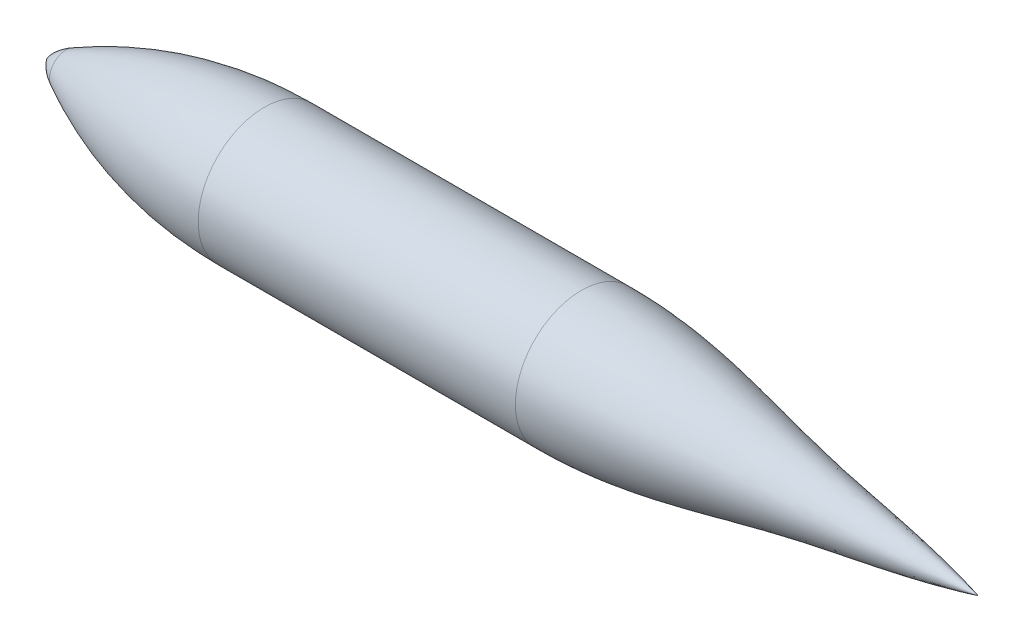
ISO-10303-21;
HEADER;
FILE_DESCRIPTION(('STEP AP214'),'2;1');
FILE_NAME('part.step','',(''),(''),'','','');
FILE_SCHEMA(('AUTOMOTIVE_DESIGN { 1 0 10303 214 1 1 1 1 }'));
ENDSEC;
DATA;
#1=APPLICATION_CONTEXT('core data for automotive mechanical design processes');
#2=APPLICATION_PROTOCOL_DEFINITION('international standard','automotive_design',2000,#1);
#3=PRODUCT_CONTEXT('',#1,'mechanical');
#4=PRODUCT('Part','Part','',(#3));
#5=PRODUCT_RELATED_PRODUCT_CATEGORY('part','',(#4));
#6=PRODUCT_DEFINITION_FORMATION('','',#4);
#7=PRODUCT_DEFINITION_CONTEXT('part definition',#1,'design');
#8=PRODUCT_DEFINITION('design','',#6,#7);
#9=PRODUCT_DEFINITION_SHAPE('','',#8);
#10=(LENGTH_UNIT() NAMED_UNIT(*) SI_UNIT(.MILLI.,.METRE.));
#11=(NAMED_UNIT(*) PLANE_ANGLE_UNIT() SI_UNIT($,.RADIAN.));
#12=(NAMED_UNIT(*) SI_UNIT($,.STERADIAN.) SOLID_ANGLE_UNIT());
#13=UNCERTAINTY_MEASURE_WITH_UNIT(LENGTH_MEASURE(1.E-05),#10,'distance_accuracy_value','');
#14=(GEOMETRIC_REPRESENTATION_CONTEXT(3) GLOBAL_UNCERTAINTY_ASSIGNED_CONTEXT((#13)) GLOBAL_UNIT_ASSIGNED_CONTEXT((#10,
#11,#12)) REPRESENTATION_CONTEXT('',''));
#15=CARTESIAN_POINT('',(0.,0.,0.));
#16=DIRECTION('',(0.,0.,1.));
#17=DIRECTION('',(1.,0.,0.));
#18=AXIS2_PLACEMENT_3D('',#15,#16,#17);
#19=CARTESIAN_POINT('',(-173.8,0.,28.97));
#20=CARTESIAN_POINT('',(-154.274057960004,0.,28.97));
#21=CARTESIAN_POINT('',(-123.601815915925,0.,24.7789597044732));
#22=CARTESIAN_POINT('',(-65.5245143266319,0.,11.0778751633801));
#23=CARTESIAN_POINT('',(-25.1896816177886,0.,6.75163002593633));
#24=CARTESIAN_POINT('',(0.,0.,0.));
#25=B_SPLINE_CURVE_WITH_KNOTS('',3,(#19,#20,#21,#22,#23,#24),.UNSPECIFIED.,.F.,.F.,(4,1,1,4),
(0.,0.305180337866786,0.55947683465441,1.),.UNSPECIFIED.);
#26=CARTESIAN_POINT('',(0.,0.,0.));
#27=DIRECTION('',(1.,0.,0.));
#28=AXIS1_PLACEMENT('',#26,#27);
#29=SURFACE_OF_REVOLUTION('',#25,#28);
#30=CARTESIAN_POINT('',(0.,0.,0.));
#31=VERTEX_POINT('',#30);
#32=VERTEX_LOOP('',#31);
#33=FACE_BOUND('',#32,.T.);
#34=CARTESIAN_POINT('',(-173.8,0.,0.));
#35=DIRECTION('',(1.,0.,0.));
#36=DIRECTION('',(0.,0.,-1.));
#37=AXIS2_PLACEMENT_3D('',#34,#35,#36);
#38=CIRCLE('',#37,28.97);
#39=CARTESIAN_POINT('',(-173.8,0.,-28.97));
#40=VERTEX_POINT('',#39);
#41=EDGE_CURVE('E58',#40,#40,#38,.T.);
#42=ORIENTED_EDGE('',*,*,#41,.T.);
#43=EDGE_LOOP('',(#42));
#44=FACE_BOUND('',#43,.T.);
#45=ADVANCED_FACE('F41',(#33,#44),#29,.T.);
#46=CARTESIAN_POINT('',(-407.984249418414,0.,0.));
#47=CARTESIAN_POINT('',(-404.778087213305,0.,4.68473583082531));
#48=CARTESIAN_POINT('',(-399.7,0.,7.24));
#49=B_SPLINE_CURVE_WITH_KNOTS('',2,(#46,#47,#48),.UNSPECIFIED.,.F.,.F.,(3,3),(0.,1.),.UNSPECIFIED.);
#50=CARTESIAN_POINT('',(0.,0.,0.));
#51=DIRECTION('',(1.,0.,0.));
#52=AXIS1_PLACEMENT('',#50,#51);
#53=SURFACE_OF_REVOLUTION('',#49,#52);
#54=CARTESIAN_POINT('',(-399.7,0.,0.));
#55=DIRECTION('',(1.,0.,0.));
#56=DIRECTION('',(0.,0.,-1.));
#57=AXIS2_PLACEMENT_3D('',#54,#55,#56);
#58=CIRCLE('',#57,7.24);
#59=CARTESIAN_POINT('',(-399.7,0.,-7.24));
#60=VERTEX_POINT('',#59);
#61=EDGE_CURVE('E11',#60,#60,#58,.T.);
#62=ORIENTED_EDGE('',*,*,#61,.F.);
#63=EDGE_LOOP('',(#62));
#64=FACE_BOUND('',#63,.T.);
#65=CARTESIAN_POINT('',(-407.984249418414,0.,0.));
#66=VERTEX_POINT('',#65);
#67=VERTEX_LOOP('',#66);
#68=FACE_BOUND('',#67,.T.);
#69=ADVANCED_FACE('F60',(#64,#68),#53,.T.);
#70=CARTESIAN_POINT('',(-399.7,0.,7.24));
#71=CARTESIAN_POINT('',(-358.928969373865,0.,28.7786385748551));
#72=CARTESIAN_POINT('',(-312.8,0.,28.97));
#73=B_SPLINE_CURVE_WITH_KNOTS('',2,(#70,#71,#72),.UNSPECIFIED.,.F.,.F.,(3,3),(0.,1.),.UNSPECIFIED.);
#74=CARTESIAN_POINT('',(0.,0.,0.));
#75=DIRECTION('',(1.,0.,0.));
#76=AXIS1_PLACEMENT('',#74,#75);
#77=SURFACE_OF_REVOLUTION('',#73,#76);
#78=CARTESIAN_POINT('',(-312.8,0.,0.));
#79=DIRECTION('',(1.,0.,0.));
#80=DIRECTION('',(0.,0.,-1.));
#81=AXIS2_PLACEMENT_3D('',#78,#79,#80);
#82=CIRCLE('',#81,28.97);
#83=CARTESIAN_POINT('',(-312.8,0.,-28.97));
#84=VERTEX_POINT('',#83);
#85=EDGE_CURVE('E47',#84,#84,#82,.T.);
#86=ORIENTED_EDGE('',*,*,#85,.F.);
#87=EDGE_LOOP('',(#86));
#88=FACE_BOUND('',#87,.T.);
#89=ORIENTED_EDGE('',*,*,#61,.T.);
#90=EDGE_LOOP('',(#89));
#91=FACE_BOUND('',#90,.T.);
#92=ADVANCED_FACE('F77',(#88,#91),#77,.T.);
#93=CARTESIAN_POINT('',(0.,0.,0.));
#94=DIRECTION('',(1.,0.,0.));
#95=DIRECTION('',(0.,0.,-1.));
#96=AXIS2_PLACEMENT_3D('',#93,#94,#95);
#97=CYLINDRICAL_SURFACE('',#96,28.97);
#98=ORIENTED_EDGE('',*,*,#41,.F.);
#99=EDGE_LOOP('',(#98));
#100=FACE_BOUND('',#99,.T.);
#101=ORIENTED_EDGE('',*,*,#85,.T.);
#102=EDGE_LOOP('',(#101));
#103=FACE_BOUND('',#102,.T.);
#104=ADVANCED_FACE('F76',(#100,#103),#97,.T.);
#105=CLOSED_SHELL('',(#45,#69,#92,#104));
#106=MANIFOLD_SOLID_BREP('B2',#105);
#107=ADVANCED_BREP_SHAPE_REPRESENTATION('',(#18,#106),#14);
#108=SHAPE_DEFINITION_REPRESENTATION(#9,#107);
ENDSEC;
END-ISO-10303-21;
